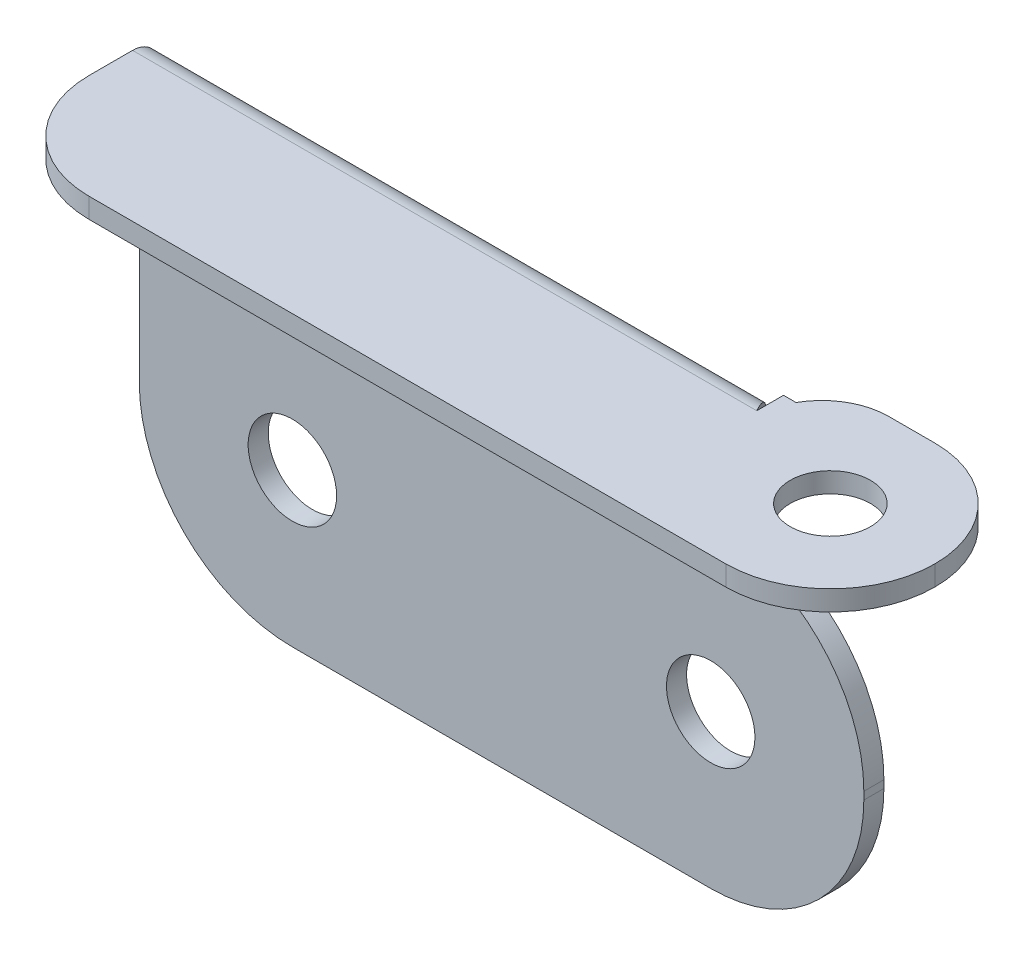
ISO-10303-21;
HEADER;
FILE_DESCRIPTION(('STEP AP214'),'2;1');
FILE_NAME('part.step','',(''),(''),'','','');
FILE_SCHEMA(('AUTOMOTIVE_DESIGN { 1 0 10303 214 1 1 1 1 }'));
ENDSEC;
DATA;
#1=APPLICATION_CONTEXT('core data for automotive mechanical design processes');
#2=APPLICATION_PROTOCOL_DEFINITION('international standard','automotive_design',2000,#1);
#3=PRODUCT_CONTEXT('',#1,'mechanical');
#4=PRODUCT('Part','Part','',(#3));
#5=PRODUCT_RELATED_PRODUCT_CATEGORY('part','',(#4));
#6=PRODUCT_DEFINITION_FORMATION('','',#4);
#7=PRODUCT_DEFINITION_CONTEXT('part definition',#1,'design');
#8=PRODUCT_DEFINITION('design','',#6,#7);
#9=PRODUCT_DEFINITION_SHAPE('','',#8);
#10=(LENGTH_UNIT() NAMED_UNIT(*) SI_UNIT(.MILLI.,.METRE.));
#11=(NAMED_UNIT(*) PLANE_ANGLE_UNIT() SI_UNIT($,.RADIAN.));
#12=(NAMED_UNIT(*) SI_UNIT($,.STERADIAN.) SOLID_ANGLE_UNIT());
#13=UNCERTAINTY_MEASURE_WITH_UNIT(LENGTH_MEASURE(1.E-05),#10,'distance_accuracy_value','');
#14=(GEOMETRIC_REPRESENTATION_CONTEXT(3) GLOBAL_UNCERTAINTY_ASSIGNED_CONTEXT((#13)) GLOBAL_UNIT_ASSIGNED_CONTEXT((#10,
#11,#12)) REPRESENTATION_CONTEXT('',''));
#15=CARTESIAN_POINT('',(0.,0.,0.));
#16=DIRECTION('',(0.,0.,1.));
#17=DIRECTION('',(1.,0.,0.));
#18=AXIS2_PLACEMENT_3D('',#15,#16,#17);
#19=CARTESIAN_POINT('',(19.8755,20.5105,13.9446));
#20=DIRECTION('',(1.,0.,0.));
#21=DIRECTION('',(0.,0.,-1.));
#22=AXIS2_PLACEMENT_3D('',#19,#20,#21);
#23=PLANE('',#22);
#24=CARTESIAN_POINT('',(19.8755,22.0345,2.032));
#25=CARTESIAN_POINT('',(19.8755,20.5105,2.032));
#26=B_SPLINE_CURVE_WITH_KNOTS('',1,(#24,#25),.UNSPECIFIED.,.F.,.F.,(2,2),(0.,1.),.UNSPECIFIED.);
#27=CARTESIAN_POINT('',(19.8755,22.0345,2.032));
#28=VERTEX_POINT('',#27);
#29=CARTESIAN_POINT('',(19.8755,20.5105,2.032));
#30=VERTEX_POINT('',#29);
#31=EDGE_CURVE('E11',#28,#30,#26,.T.);
#32=ORIENTED_EDGE('',*,*,#31,.F.);
#33=DIRECTION('',(0.,0.,1.));
#34=VECTOR('',#33,1.);
#35=CARTESIAN_POINT('',(19.8755,22.0345,13.2715));
#36=LINE('',#35,#34);
#37=CARTESIAN_POINT('',(19.8755,22.0345,0.));
#38=VERTEX_POINT('',#37);
#39=EDGE_CURVE('E126',#28,#38,#36,.F.);
#40=ORIENTED_EDGE('',*,*,#39,.T.);
#41=DIRECTION('',(0.,-1.,0.));
#42=VECTOR('',#41,1.);
#43=CARTESIAN_POINT('',(19.8755,20.5105,0.));
#44=LINE('',#43,#42);
#45=CARTESIAN_POINT('',(19.8755,20.5105,0.));
#46=VERTEX_POINT('',#45);
#47=EDGE_CURVE('E48',#38,#46,#44,.T.);
#48=ORIENTED_EDGE('',*,*,#47,.T.);
#49=DIRECTION('',(0.,0.,-1.));
#50=VECTOR('',#49,1.);
#51=CARTESIAN_POINT('',(19.8755,20.5105,13.9446));
#52=LINE('',#51,#50);
#53=EDGE_CURVE('E128',#30,#46,#52,.T.);
#54=ORIENTED_EDGE('',*,*,#53,.F.);
#55=EDGE_LOOP('',(#32,#40,#48,#54));
#56=FACE_BOUND('',#55,.T.);
#57=ADVANCED_FACE('F37',(#56),#23,.F.);
#58=CARTESIAN_POINT('',(19.8755,20.5105,0.));
#59=DIRECTION('',(0.,0.,1.));
#60=DIRECTION('',(1.,0.,0.));
#61=AXIS2_PLACEMENT_3D('',#58,#59,#60);
#62=PLANE('',#61);
#63=ORIENTED_EDGE('',*,*,#47,.F.);
#64=DIRECTION('',(-1.,0.,0.));
#65=VECTOR('',#64,1.);
#66=CARTESIAN_POINT('',(36.703,22.0345,0.));
#67=LINE('',#66,#65);
#68=CARTESIAN_POINT('',(20.828,22.0345,0.));
#69=VERTEX_POINT('',#68);
#70=EDGE_CURVE('E157',#38,#69,#67,.F.);
#71=ORIENTED_EDGE('',*,*,#70,.T.);
#72=DIRECTION('',(0.,-1.,0.));
#73=VECTOR('',#72,1.);
#74=CARTESIAN_POINT('',(20.828,20.5105,0.));
#75=LINE('',#74,#73);
#76=CARTESIAN_POINT('',(20.828,20.5105,0.));
#77=VERTEX_POINT('',#76);
#78=EDGE_CURVE('E205',#69,#77,#75,.T.);
#79=ORIENTED_EDGE('',*,*,#78,.T.);
#80=DIRECTION('',(1.,0.,0.));
#81=VECTOR('',#80,1.);
#82=CARTESIAN_POINT('',(19.8755,20.5105,0.));
#83=LINE('',#82,#81);
#84=EDGE_CURVE('E487',#46,#77,#83,.T.);
#85=ORIENTED_EDGE('',*,*,#84,.F.);
#86=EDGE_LOOP('',(#63,#71,#79,#85));
#87=FACE_BOUND('',#86,.T.);
#88=ADVANCED_FACE('F477',(#87),#62,.F.);
#89=CARTESIAN_POINT('',(25.2634647727155,20.5105,2.4765));
#90=DIRECTION('',(0.,1.,0.));
#91=DIRECTION('',(-1.,0.,0.));
#92=AXIS2_PLACEMENT_3D('',#89,#90,#91);
#93=CYLINDRICAL_SURFACE('',#92,5.08);
#94=ORIENTED_EDGE('',*,*,#78,.F.);
#95=CARTESIAN_POINT('',(25.2634647727155,22.0345,2.4765));
#96=DIRECTION('',(0.,1.,0.));
#97=DIRECTION('',(-1.,0.,0.));
#98=AXIS2_PLACEMENT_3D('',#95,#96,#97);
#99=CIRCLE('',#98,5.08);
#100=CARTESIAN_POINT('',(25.2634647727155,22.0345,-2.60349999999999));
#101=VERTEX_POINT('',#100);
#102=EDGE_CURVE('E367',#69,#101,#99,.F.);
#103=ORIENTED_EDGE('',*,*,#102,.T.);
#104=DIRECTION('',(0.,-1.,0.));
#105=VECTOR('',#104,1.);
#106=CARTESIAN_POINT('',(25.2634647727155,20.5105,-2.6035));
#107=LINE('',#106,#105);
#108=CARTESIAN_POINT('',(25.2634647727155,20.5105,-2.6035));
#109=VERTEX_POINT('',#108);
#110=EDGE_CURVE('E208',#101,#109,#107,.T.);
#111=ORIENTED_EDGE('',*,*,#110,.T.);
#112=CARTESIAN_POINT('',(25.2634647727155,20.5105,2.4765));
#113=DIRECTION('',(0.,1.,0.));
#114=DIRECTION('',(-1.,0.,0.));
#115=AXIS2_PLACEMENT_3D('',#112,#113,#114);
#116=CIRCLE('',#115,5.08);
#117=EDGE_CURVE('E548',#77,#109,#116,.F.);
#118=ORIENTED_EDGE('',*,*,#117,.F.);
#119=EDGE_LOOP('',(#94,#103,#111,#118));
#120=FACE_BOUND('',#119,.T.);
#121=ADVANCED_FACE('F474',(#120),#93,.T.);
#122=CARTESIAN_POINT('',(36.703,20.5105,-2.6035));
#123=DIRECTION('',(0.,0.,1.));
#124=DIRECTION('',(1.,0.,0.));
#125=AXIS2_PLACEMENT_3D('',#122,#123,#124);
#126=PLANE('',#125);
#127=ORIENTED_EDGE('',*,*,#110,.F.);
#128=DIRECTION('',(-1.,0.,0.));
#129=VECTOR('',#128,1.);
#130=CARTESIAN_POINT('',(36.703,22.0345,-2.60349999999999));
#131=LINE('',#130,#129);
#132=CARTESIAN_POINT('',(28.7655,22.0345,-2.6035));
#133=VERTEX_POINT('',#132);
#134=EDGE_CURVE('E364',#101,#133,#131,.F.);
#135=ORIENTED_EDGE('',*,*,#134,.T.);
#136=DIRECTION('',(0.,-1.,0.));
#137=VECTOR('',#136,1.);
#138=CARTESIAN_POINT('',(28.7655,20.5105,-2.6035));
#139=LINE('',#138,#137);
#140=CARTESIAN_POINT('',(28.7655,20.5105,-2.6035));
#141=VERTEX_POINT('',#140);
#142=EDGE_CURVE('E211',#133,#141,#139,.T.);
#143=ORIENTED_EDGE('',*,*,#142,.T.);
#144=DIRECTION('',(1.,0.,0.));
#145=VECTOR('',#144,1.);
#146=CARTESIAN_POINT('',(36.703,20.5105,-2.6035));
#147=LINE('',#146,#145);
#148=EDGE_CURVE('E545',#109,#141,#147,.T.);
#149=ORIENTED_EDGE('',*,*,#148,.F.);
#150=EDGE_LOOP('',(#127,#135,#143,#149));
#151=FACE_BOUND('',#150,.T.);
#152=ADVANCED_FACE('F470',(#151),#126,.F.);
#153=CARTESIAN_POINT('',(28.7655,20.5105,5.334));
#154=DIRECTION('',(0.,1.,0.));
#155=DIRECTION('',(-1.,0.,0.));
#156=AXIS2_PLACEMENT_3D('',#153,#154,#155);
#157=CYLINDRICAL_SURFACE('',#156,7.9375);
#158=ORIENTED_EDGE('',*,*,#142,.F.);
#159=CARTESIAN_POINT('',(28.7655,22.0345,5.334));
#160=DIRECTION('',(0.,1.,0.));
#161=DIRECTION('',(-1.,0.,0.));
#162=AXIS2_PLACEMENT_3D('',#159,#160,#161);
#163=CIRCLE('',#162,7.9375);
#164=CARTESIAN_POINT('',(36.703,22.0345,5.334));
#165=VERTEX_POINT('',#164);
#166=EDGE_CURVE('E361',#133,#165,#163,.F.);
#167=ORIENTED_EDGE('',*,*,#166,.T.);
#168=DIRECTION('',(0.,-1.,0.));
#169=VECTOR('',#168,1.);
#170=CARTESIAN_POINT('',(36.703,20.5105,5.334));
#171=LINE('',#170,#169);
#172=CARTESIAN_POINT('',(36.703,20.5105,5.334));
#173=VERTEX_POINT('',#172);
#174=EDGE_CURVE('E214',#165,#173,#171,.T.);
#175=ORIENTED_EDGE('',*,*,#174,.T.);
#176=CARTESIAN_POINT('',(28.7655,20.5105,5.334));
#177=DIRECTION('',(0.,1.,0.));
#178=DIRECTION('',(-1.,0.,0.));
#179=AXIS2_PLACEMENT_3D('',#176,#177,#178);
#180=CIRCLE('',#179,7.9375);
#181=EDGE_CURVE('E542',#141,#173,#180,.F.);
#182=ORIENTED_EDGE('',*,*,#181,.F.);
#183=EDGE_LOOP('',(#158,#167,#175,#182));
#184=FACE_BOUND('',#183,.T.);
#185=ADVANCED_FACE('F466',(#184),#157,.T.);
#186=CARTESIAN_POINT('',(28.7655,20.5105,5.334));
#187=DIRECTION('',(0.,1.,0.));
#188=DIRECTION('',(-1.,0.,0.));
#189=AXIS2_PLACEMENT_3D('',#186,#187,#188);
#190=CYLINDRICAL_SURFACE('',#189,7.9375);
#191=ORIENTED_EDGE('',*,*,#174,.F.);
#192=CARTESIAN_POINT('',(28.7655,22.0345,5.334));
#193=DIRECTION('',(0.,1.,0.));
#194=DIRECTION('',(-1.,0.,0.));
#195=AXIS2_PLACEMENT_3D('',#192,#193,#194);
#196=CIRCLE('',#195,7.9375);
#197=CARTESIAN_POINT('',(28.7655,22.0345,13.2715));
#198=VERTEX_POINT('',#197);
#199=EDGE_CURVE('E358',#165,#198,#196,.F.);
#200=ORIENTED_EDGE('',*,*,#199,.T.);
#201=DIRECTION('',(0.,-1.,0.));
#202=VECTOR('',#201,1.);
#203=CARTESIAN_POINT('',(28.7655,20.5105,13.2715));
#204=LINE('',#203,#202);
#205=CARTESIAN_POINT('',(28.7655,20.5105,13.2715));
#206=VERTEX_POINT('',#205);
#207=EDGE_CURVE('E217',#198,#206,#204,.T.);
#208=ORIENTED_EDGE('',*,*,#207,.T.);
#209=CARTESIAN_POINT('',(28.7655,20.5105,5.334));
#210=DIRECTION('',(0.,1.,0.));
#211=DIRECTION('',(-1.,0.,0.));
#212=AXIS2_PLACEMENT_3D('',#209,#210,#211);
#213=CIRCLE('',#212,7.9375);
#214=EDGE_CURVE('E538',#173,#206,#213,.F.);
#215=ORIENTED_EDGE('',*,*,#214,.F.);
#216=EDGE_LOOP('',(#191,#200,#208,#215));
#217=FACE_BOUND('',#216,.T.);
#218=ADVANCED_FACE('F462',(#217),#190,.T.);
#219=CARTESIAN_POINT('',(36.703,20.5105,13.2715));
#220=DIRECTION('',(0.,0.,1.));
#221=DIRECTION('',(1.,0.,0.));
#222=AXIS2_PLACEMENT_3D('',#219,#220,#221);
#223=PLANE('',#222);
#224=ORIENTED_EDGE('',*,*,#207,.F.);
#225=DIRECTION('',(-1.,0.,0.));
#226=VECTOR('',#225,1.);
#227=CARTESIAN_POINT('',(36.703,22.0345,13.2715));
#228=LINE('',#227,#226);
#229=CARTESIAN_POINT('',(-19.558,22.0345,13.2715));
#230=VERTEX_POINT('',#229);
#231=EDGE_CURVE('E355',#230,#198,#228,.F.);
#232=ORIENTED_EDGE('',*,*,#231,.F.);
#233=DIRECTION('',(0.,-1.,0.));
#234=VECTOR('',#233,1.);
#235=CARTESIAN_POINT('',(-19.558,20.5105,13.2715));
#236=LINE('',#235,#234);
#237=CARTESIAN_POINT('',(-19.558,20.5105,13.2715));
#238=VERTEX_POINT('',#237);
#239=EDGE_CURVE('E220',#230,#238,#236,.T.);
#240=ORIENTED_EDGE('',*,*,#239,.T.);
#241=DIRECTION('',(1.,0.,0.));
#242=VECTOR('',#241,1.);
#243=CARTESIAN_POINT('',(36.703,20.5105,13.2715));
#244=LINE('',#243,#242);
#245=EDGE_CURVE('E535',#238,#206,#244,.T.);
#246=ORIENTED_EDGE('',*,*,#245,.T.);
#247=EDGE_LOOP('',(#224,#232,#240,#246));
#248=FACE_BOUND('',#247,.T.);
#249=ADVANCED_FACE('F458',(#248),#223,.T.);
#250=CARTESIAN_POINT('',(-19.558,20.5105,5.334));
#251=DIRECTION('',(0.,1.,0.));
#252=DIRECTION('',(-1.,0.,0.));
#253=AXIS2_PLACEMENT_3D('',#250,#251,#252);
#254=CYLINDRICAL_SURFACE('',#253,7.9375);
#255=ORIENTED_EDGE('',*,*,#239,.F.);
#256=CARTESIAN_POINT('',(-19.558,22.0345,5.334));
#257=DIRECTION('',(0.,1.,0.));
#258=DIRECTION('',(-1.,0.,0.));
#259=AXIS2_PLACEMENT_3D('',#256,#257,#258);
#260=CIRCLE('',#259,7.9375);
#261=CARTESIAN_POINT('',(-27.4955,22.0345,5.33400000000002));
#262=VERTEX_POINT('',#261);
#263=EDGE_CURVE('E352',#230,#262,#260,.F.);
#264=ORIENTED_EDGE('',*,*,#263,.T.);
#265=DIRECTION('',(0.,-1.,0.));
#266=VECTOR('',#265,1.);
#267=CARTESIAN_POINT('',(-27.4955,20.5105,5.33400000000001));
#268=LINE('',#267,#266);
#269=CARTESIAN_POINT('',(-27.4955,20.5105,5.33400000000001));
#270=VERTEX_POINT('',#269);
#271=EDGE_CURVE('E223',#262,#270,#268,.T.);
#272=ORIENTED_EDGE('',*,*,#271,.T.);
#273=CARTESIAN_POINT('',(-19.558,20.5105,5.334));
#274=DIRECTION('',(0.,1.,0.));
#275=DIRECTION('',(-1.,0.,0.));
#276=AXIS2_PLACEMENT_3D('',#273,#274,#275);
#277=CIRCLE('',#276,7.9375);
#278=EDGE_CURVE('E499',#238,#270,#277,.F.);
#279=ORIENTED_EDGE('',*,*,#278,.F.);
#280=EDGE_LOOP('',(#255,#264,#272,#279));
#281=FACE_BOUND('',#280,.T.);
#282=ADVANCED_FACE('F454',(#281),#254,.T.);
#283=CARTESIAN_POINT('',(-27.4955,20.5105,58.4457141962647));
#284=DIRECTION('',(1.,0.,0.));
#285=DIRECTION('',(0.,0.,-1.));
#286=AXIS2_PLACEMENT_3D('',#283,#284,#285);
#287=PLANE('',#286);
#288=ORIENTED_EDGE('',*,*,#271,.F.);
#289=DIRECTION('',(0.,0.,1.));
#290=VECTOR('',#289,1.);
#291=CARTESIAN_POINT('',(-27.4955,22.0345,13.2715));
#292=LINE('',#291,#290);
#293=CARTESIAN_POINT('',(-27.4955,22.0345,2.03200000000002));
#294=VERTEX_POINT('',#293);
#295=EDGE_CURVE('E159',#262,#294,#292,.F.);
#296=ORIENTED_EDGE('',*,*,#295,.T.);
#297=DIRECTION('',(0.,-1.,0.));
#298=VECTOR('',#297,1.);
#299=CARTESIAN_POINT('',(-27.4955,20.5105,2.03200000000001));
#300=LINE('',#299,#298);
#301=CARTESIAN_POINT('',(-27.4955,20.5105,2.03200000000001));
#302=VERTEX_POINT('',#301);
#303=EDGE_CURVE('E226',#294,#302,#300,.T.);
#304=ORIENTED_EDGE('',*,*,#303,.T.);
#305=DIRECTION('',(0.,0.,-1.));
#306=VECTOR('',#305,1.);
#307=CARTESIAN_POINT('',(-27.4955,20.5105,58.4457141962647));
#308=LINE('',#307,#306);
#309=EDGE_CURVE('E496',#270,#302,#308,.T.);
#310=ORIENTED_EDGE('',*,*,#309,.F.);
#311=EDGE_LOOP('',(#288,#296,#304,#310));
#312=FACE_BOUND('',#311,.T.);
#313=ADVANCED_FACE('F451',(#312),#287,.F.);
#314=CARTESIAN_POINT('',(-27.4955,20.0025,2.032));
#315=DIRECTION('',(-1.,0.,0.));
#316=DIRECTION('',(0.,-1.,0.));
#317=AXIS2_PLACEMENT_3D('',#314,#315,#316);
#318=PLANE('',#317);
#319=ORIENTED_EDGE('',*,*,#303,.F.);
#320=CARTESIAN_POINT('',(-27.4955,20.0025,2.032));
#321=DIRECTION('',(1.,0.,0.));
#322=DIRECTION('',(0.,1.,0.));
#323=AXIS2_PLACEMENT_3D('',#320,#321,#322);
#324=CIRCLE('',#323,2.032);
#325=CARTESIAN_POINT('',(-27.4955,20.0025,0.));
#326=VERTEX_POINT('',#325);
#327=EDGE_CURVE('E146',#294,#326,#324,.F.);
#328=ORIENTED_EDGE('',*,*,#327,.T.);
#329=DIRECTION('',(0.,0.,1.));
#330=VECTOR('',#329,1.);
#331=CARTESIAN_POINT('',(-27.4955,20.0025,1.524));
#332=LINE('',#331,#330);
#333=CARTESIAN_POINT('',(-27.4955,20.0025,1.524));
#334=VERTEX_POINT('',#333);
#335=EDGE_CURVE('E229',#326,#334,#332,.T.);
#336=ORIENTED_EDGE('',*,*,#335,.T.);
#337=CARTESIAN_POINT('',(-27.4955,20.0025,2.032));
#338=DIRECTION('',(1.,0.,0.));
#339=DIRECTION('',(0.,1.,0.));
#340=AXIS2_PLACEMENT_3D('',#337,#338,#339);
#341=CIRCLE('',#340,0.508);
#342=EDGE_CURVE('E280',#302,#334,#341,.F.);
#343=ORIENTED_EDGE('',*,*,#342,.F.);
#344=EDGE_LOOP('',(#319,#328,#336,#343));
#345=FACE_BOUND('',#344,.T.);
#346=ADVANCED_FACE('F448',(#345),#318,.T.);
#347=CARTESIAN_POINT('',(-27.4955,22.0345,1.524));
#348=DIRECTION('',(-1.,0.,0.));
#349=DIRECTION('',(0.,-1.,0.));
#350=AXIS2_PLACEMENT_3D('',#347,#348,#349);
#351=PLANE('',#350);
#352=ORIENTED_EDGE('',*,*,#335,.F.);
#353=DIRECTION('',(0.,1.,0.));
#354=VECTOR('',#353,1.);
#355=CARTESIAN_POINT('',(-27.4955,0.,0.));
#356=LINE('',#355,#354);
#357=CARTESIAN_POINT('',(-27.4955,0.,0.));
#358=VERTEX_POINT('',#357);
#359=EDGE_CURVE('E326',#326,#358,#356,.F.);
#360=ORIENTED_EDGE('',*,*,#359,.T.);
#361=DIRECTION('',(0.,0.,1.));
#362=VECTOR('',#361,1.);
#363=CARTESIAN_POINT('',(-27.4955,0.,1.524));
#364=LINE('',#363,#362);
#365=CARTESIAN_POINT('',(-27.4955,0.,1.524));
#366=VERTEX_POINT('',#365);
#367=EDGE_CURVE('E231',#358,#366,#364,.T.);
#368=ORIENTED_EDGE('',*,*,#367,.T.);
#369=DIRECTION('',(0.,-1.,0.));
#370=VECTOR('',#369,1.);
#371=CARTESIAN_POINT('',(-27.4955,22.0345,1.524));
#372=LINE('',#371,#370);
#373=EDGE_CURVE('E291',#334,#366,#372,.T.);
#374=ORIENTED_EDGE('',*,*,#373,.F.);
#375=EDGE_LOOP('',(#352,#360,#368,#374));
#376=FACE_BOUND('',#375,.T.);
#377=ADVANCED_FACE('F292',(#376),#351,.T.);
#378=CARTESIAN_POINT('',(-15.875,0.,1.524));
#379=DIRECTION('',(0.,0.,1.));
#380=DIRECTION('',(1.,0.,0.));
#381=AXIS2_PLACEMENT_3D('',#378,#379,#380);
#382=CYLINDRICAL_SURFACE('',#381,11.6205);
#383=ORIENTED_EDGE('',*,*,#367,.F.);
#384=CARTESIAN_POINT('',(-15.875,0.,0.));
#385=DIRECTION('',(0.,0.,1.));
#386=DIRECTION('',(1.,0.,0.));
#387=AXIS2_PLACEMENT_3D('',#384,#385,#386);
#388=CIRCLE('',#387,11.6205);
#389=CARTESIAN_POINT('',(-15.875,-11.6205,0.));
#390=VERTEX_POINT('',#389);
#391=EDGE_CURVE('E345',#358,#390,#388,.T.);
#392=ORIENTED_EDGE('',*,*,#391,.T.);
#393=DIRECTION('',(0.,0.,1.));
#394=VECTOR('',#393,1.);
#395=CARTESIAN_POINT('',(-15.875,-11.6205,1.524));
#396=LINE('',#395,#394);
#397=CARTESIAN_POINT('',(-15.875,-11.6205,1.524));
#398=VERTEX_POINT('',#397);
#399=EDGE_CURVE('E234',#390,#398,#396,.T.);
#400=ORIENTED_EDGE('',*,*,#399,.T.);
#401=CARTESIAN_POINT('',(-15.875,0.,1.524));
#402=DIRECTION('',(0.,0.,1.));
#403=DIRECTION('',(1.,0.,0.));
#404=AXIS2_PLACEMENT_3D('',#401,#402,#403);
#405=CIRCLE('',#404,11.6205);
#406=EDGE_CURVE('E297',#366,#398,#405,.T.);
#407=ORIENTED_EDGE('',*,*,#406,.F.);
#408=EDGE_LOOP('',(#383,#392,#400,#407));
#409=FACE_BOUND('',#408,.T.);
#410=ADVANCED_FACE('F441',(#409),#382,.T.);
#411=CARTESIAN_POINT('',(-27.4955,-11.6205,1.524));
#412=DIRECTION('',(0.,-1.,0.));
#413=DIRECTION('',(1.,0.,0.));
#414=AXIS2_PLACEMENT_3D('',#411,#412,#413);
#415=PLANE('',#414);
#416=ORIENTED_EDGE('',*,*,#399,.F.);
#417=DIRECTION('',(1.,0.,0.));
#418=VECTOR('',#417,1.);
#419=CARTESIAN_POINT('',(0.,-11.6205,0.));
#420=LINE('',#419,#418);
#421=CARTESIAN_POINT('',(15.875,-11.6205,0.));
#422=VERTEX_POINT('',#421);
#423=EDGE_CURVE('E342',#390,#422,#420,.T.);
#424=ORIENTED_EDGE('',*,*,#423,.T.);
#425=DIRECTION('',(0.,0.,1.));
#426=VECTOR('',#425,1.);
#427=CARTESIAN_POINT('',(15.875,-11.6205,1.524));
#428=LINE('',#427,#426);
#429=CARTESIAN_POINT('',(15.875,-11.6205,1.524));
#430=VERTEX_POINT('',#429);
#431=EDGE_CURVE('E237',#422,#430,#428,.T.);
#432=ORIENTED_EDGE('',*,*,#431,.T.);
#433=DIRECTION('',(1.,0.,0.));
#434=VECTOR('',#433,1.);
#435=CARTESIAN_POINT('',(-27.4955,-11.6205,1.524));
#436=LINE('',#435,#434);
#437=EDGE_CURVE('E300',#398,#430,#436,.T.);
#438=ORIENTED_EDGE('',*,*,#437,.F.);
#439=EDGE_LOOP('',(#416,#424,#432,#438));
#440=FACE_BOUND('',#439,.T.);
#441=ADVANCED_FACE('F437',(#440),#415,.T.);
#442=CARTESIAN_POINT('',(15.875,0.,1.524));
#443=DIRECTION('',(0.,0.,1.));
#444=DIRECTION('',(1.,0.,0.));
#445=AXIS2_PLACEMENT_3D('',#442,#443,#444);
#446=CYLINDRICAL_SURFACE('',#445,11.6205);
#447=ORIENTED_EDGE('',*,*,#431,.F.);
#448=CARTESIAN_POINT('',(15.875,0.,0.));
#449=DIRECTION('',(0.,0.,1.));
#450=DIRECTION('',(1.,0.,0.));
#451=AXIS2_PLACEMENT_3D('',#448,#449,#450);
#452=CIRCLE('',#451,11.6205);
#453=CARTESIAN_POINT('',(27.4955,0.,0.));
#454=VERTEX_POINT('',#453);
#455=EDGE_CURVE('E339',#422,#454,#452,.T.);
#456=ORIENTED_EDGE('',*,*,#455,.T.);
#457=DIRECTION('',(0.,0.,1.));
#458=VECTOR('',#457,1.);
#459=CARTESIAN_POINT('',(27.4955,0.,1.524));
#460=LINE('',#459,#458);
#461=CARTESIAN_POINT('',(27.4955,0.,1.524));
#462=VERTEX_POINT('',#461);
#463=EDGE_CURVE('E240',#454,#462,#460,.T.);
#464=ORIENTED_EDGE('',*,*,#463,.T.);
#465=CARTESIAN_POINT('',(15.875,0.,1.524));
#466=DIRECTION('',(0.,0.,1.));
#467=DIRECTION('',(1.,0.,0.));
#468=AXIS2_PLACEMENT_3D('',#465,#466,#467);
#469=CIRCLE('',#468,11.6205);
#470=EDGE_CURVE('E309',#430,#462,#469,.T.);
#471=ORIENTED_EDGE('',*,*,#470,.F.);
#472=EDGE_LOOP('',(#447,#456,#464,#471));
#473=FACE_BOUND('',#472,.T.);
#474=ADVANCED_FACE('F433',(#473),#446,.T.);
#475=CARTESIAN_POINT('',(27.4955,11.6205,1.524));
#476=DIRECTION('',(1.,0.,0.));
#477=DIRECTION('',(0.,1.,0.));
#478=AXIS2_PLACEMENT_3D('',#475,#476,#477);
#479=PLANE('',#478);
#480=ORIENTED_EDGE('',*,*,#463,.F.);
#481=DIRECTION('',(0.,1.,0.));
#482=VECTOR('',#481,1.);
#483=CARTESIAN_POINT('',(27.4955,0.,0.));
#484=LINE('',#483,#482);
#485=CARTESIAN_POINT('',(27.4955,0.576842171565131,0.));
#486=VERTEX_POINT('',#485);
#487=EDGE_CURVE('E336',#454,#486,#484,.T.);
#488=ORIENTED_EDGE('',*,*,#487,.T.);
#489=DIRECTION('',(0.,0.,1.));
#490=VECTOR('',#489,1.);
#491=CARTESIAN_POINT('',(27.4955,0.576842171565131,1.524));
#492=LINE('',#491,#490);
#493=CARTESIAN_POINT('',(27.4955,0.576842171565131,1.524));
#494=VERTEX_POINT('',#493);
#495=EDGE_CURVE('E243',#486,#494,#492,.T.);
#496=ORIENTED_EDGE('',*,*,#495,.T.);
#497=DIRECTION('',(0.,1.,0.));
#498=VECTOR('',#497,1.);
#499=CARTESIAN_POINT('',(27.4955,11.6205,1.524));
#500=LINE('',#499,#498);
#501=EDGE_CURVE('E312',#462,#494,#500,.T.);
#502=ORIENTED_EDGE('',*,*,#501,.F.);
#503=EDGE_LOOP('',(#480,#488,#496,#502));
#504=FACE_BOUND('',#503,.T.);
#505=ADVANCED_FACE('F429',(#504),#479,.T.);
#506=CARTESIAN_POINT('',(15.875,0.576842171565131,1.524));
#507=DIRECTION('',(0.,0.,1.));
#508=DIRECTION('',(1.,0.,0.));
#509=AXIS2_PLACEMENT_3D('',#506,#507,#508);
#510=CYLINDRICAL_SURFACE('',#509,11.6205);
#511=ORIENTED_EDGE('',*,*,#495,.F.);
#512=CARTESIAN_POINT('',(15.875,0.576842171565131,0.));
#513=DIRECTION('',(0.,0.,1.));
#514=DIRECTION('',(1.,0.,0.));
#515=AXIS2_PLACEMENT_3D('',#512,#513,#514);
#516=CIRCLE('',#515,11.6205);
#517=CARTESIAN_POINT('',(19.1579215246637,11.7239694478144,0.));
#518=VERTEX_POINT('',#517);
#519=EDGE_CURVE('E333',#486,#518,#516,.T.);
#520=ORIENTED_EDGE('',*,*,#519,.T.);
#521=DIRECTION('',(0.,0.,1.));
#522=VECTOR('',#521,1.);
#523=CARTESIAN_POINT('',(19.1579215246637,11.7239694478144,1.524));
#524=LINE('',#523,#522);
#525=CARTESIAN_POINT('',(19.1579215246637,11.7239694478144,1.524));
#526=VERTEX_POINT('',#525);
#527=EDGE_CURVE('E246',#518,#526,#524,.T.);
#528=ORIENTED_EDGE('',*,*,#527,.T.);
#529=CARTESIAN_POINT('',(15.875,0.576842171565131,1.524));
#530=DIRECTION('',(0.,0.,1.));
#531=DIRECTION('',(1.,0.,0.));
#532=AXIS2_PLACEMENT_3D('',#529,#530,#531);
#533=CIRCLE('',#532,11.6205);
#534=EDGE_CURVE('E315',#494,#526,#533,.T.);
#535=ORIENTED_EDGE('',*,*,#534,.F.);
#536=EDGE_LOOP('',(#511,#520,#528,#535));
#537=FACE_BOUND('',#536,.T.);
#538=ADVANCED_FACE('F426',(#537),#510,.T.);
#539=CARTESIAN_POINT('',(19.8755,14.1605,1.524));
#540=DIRECTION('',(0.,0.,1.));
#541=DIRECTION('',(1.,0.,0.));
#542=AXIS2_PLACEMENT_3D('',#539,#540,#541);
#543=CYLINDRICAL_SURFACE('',#542,2.54);
#544=ORIENTED_EDGE('',*,*,#527,.F.);
#545=CARTESIAN_POINT('',(19.8755,14.1605,0.));
#546=DIRECTION('',(0.,0.,1.));
#547=DIRECTION('',(1.,0.,0.));
#548=AXIS2_PLACEMENT_3D('',#545,#546,#547);
#549=CIRCLE('',#548,2.54);
#550=CARTESIAN_POINT('',(17.3355,14.1605,0.));
#551=VERTEX_POINT('',#550);
#552=EDGE_CURVE('E330',#551,#518,#549,.T.);
#553=ORIENTED_EDGE('',*,*,#552,.F.);
#554=DIRECTION('',(0.,0.,1.));
#555=VECTOR('',#554,1.);
#556=CARTESIAN_POINT('',(17.3355,14.1605,1.524));
#557=LINE('',#556,#555);
#558=CARTESIAN_POINT('',(17.3355,14.1605,1.524));
#559=VERTEX_POINT('',#558);
#560=EDGE_CURVE('E248',#551,#559,#557,.T.);
#561=ORIENTED_EDGE('',*,*,#560,.T.);
#562=CARTESIAN_POINT('',(19.8755,14.1605,1.524));
#563=DIRECTION('',(0.,0.,1.));
#564=DIRECTION('',(1.,0.,0.));
#565=AXIS2_PLACEMENT_3D('',#562,#563,#564);
#566=CIRCLE('',#565,2.54);
#567=EDGE_CURVE('E318',#559,#526,#566,.T.);
#568=ORIENTED_EDGE('',*,*,#567,.T.);
#569=EDGE_LOOP('',(#544,#553,#561,#568));
#570=FACE_BOUND('',#569,.T.);
#571=ADVANCED_FACE('F423',(#570),#543,.F.);
#572=CARTESIAN_POINT('',(17.3355,0.,1.524));
#573=DIRECTION('',(-1.,0.,0.));
#574=DIRECTION('',(0.,-1.,0.));
#575=AXIS2_PLACEMENT_3D('',#572,#573,#574);
#576=PLANE('',#575);
#577=ORIENTED_EDGE('',*,*,#560,.F.);
#578=DIRECTION('',(0.,1.,0.));
#579=VECTOR('',#578,1.);
#580=CARTESIAN_POINT('',(17.3355,0.,0.));
#581=LINE('',#580,#579);
#582=CARTESIAN_POINT('',(17.3355,17.9705,0.));
#583=VERTEX_POINT('',#582);
#584=EDGE_CURVE('E327',#583,#551,#581,.F.);
#585=ORIENTED_EDGE('',*,*,#584,.F.);
#586=DIRECTION('',(0.,0.,1.));
#587=VECTOR('',#586,1.);
#588=CARTESIAN_POINT('',(17.3355,17.9705,1.524));
#589=LINE('',#588,#587);
#590=CARTESIAN_POINT('',(17.3355,17.9705,1.524));
#591=VERTEX_POINT('',#590);
#592=EDGE_CURVE('E172',#583,#591,#589,.T.);
#593=ORIENTED_EDGE('',*,*,#592,.T.);
#594=DIRECTION('',(0.,-1.,0.));
#595=VECTOR('',#594,1.);
#596=CARTESIAN_POINT('',(17.3355,0.,1.524));
#597=LINE('',#596,#595);
#598=EDGE_CURVE('E281',#591,#559,#597,.T.);
#599=ORIENTED_EDGE('',*,*,#598,.T.);
#600=EDGE_LOOP('',(#577,#585,#593,#599));
#601=FACE_BOUND('',#600,.T.);
#602=ADVANCED_FACE('F405',(#601),#576,.F.);
#603=CARTESIAN_POINT('',(19.8755,17.9705,1.524));
#604=DIRECTION('',(0.,0.,1.));
#605=DIRECTION('',(1.,0.,0.));
#606=AXIS2_PLACEMENT_3D('',#603,#604,#605);
#607=CYLINDRICAL_SURFACE('',#606,2.54);
#608=ORIENTED_EDGE('',*,*,#592,.F.);
#609=CARTESIAN_POINT('',(19.8755,17.9705,0.));
#610=DIRECTION('',(0.,0.,1.));
#611=DIRECTION('',(1.,0.,0.));
#612=AXIS2_PLACEMENT_3D('',#609,#610,#611);
#613=CIRCLE('',#612,2.54);
#614=CARTESIAN_POINT('',(18.3515,20.0025,0.));
#615=VERTEX_POINT('',#614);
#616=EDGE_CURVE('E151',#615,#583,#613,.T.);
#617=ORIENTED_EDGE('',*,*,#616,.F.);
#618=CARTESIAN_POINT('',(18.3515,20.0025,1.524));
#619=CARTESIAN_POINT('',(18.3515,20.0025,0.));
#620=B_SPLINE_CURVE_WITH_KNOTS('',1,(#618,#619),.UNSPECIFIED.,.F.,.F.,(2,2),(0.,1.),.UNSPECIFIED.);
#621=CARTESIAN_POINT('',(18.3515,20.0025,1.524));
#622=VERTEX_POINT('',#621);
#623=EDGE_CURVE('E56',#615,#622,#620,.F.);
#624=ORIENTED_EDGE('',*,*,#623,.T.);
#625=CARTESIAN_POINT('',(19.8755,17.9705,1.524));
#626=DIRECTION('',(0.,0.,1.));
#627=DIRECTION('',(1.,0.,0.));
#628=AXIS2_PLACEMENT_3D('',#625,#626,#627);
#629=CIRCLE('',#628,2.54);
#630=EDGE_CURVE('E269',#622,#591,#629,.T.);
#631=ORIENTED_EDGE('',*,*,#630,.T.);
#632=EDGE_LOOP('',(#608,#617,#624,#631));
#633=FACE_BOUND('',#632,.T.);
#634=ADVANCED_FACE('F401',(#633),#607,.F.);
#635=CARTESIAN_POINT('',(28.7655,20.5105,5.334));
#636=DIRECTION('',(0.,1.,0.));
#637=DIRECTION('',(-1.,0.,0.));
#638=AXIS2_PLACEMENT_3D('',#635,#636,#637);
#639=CYLINDRICAL_SURFACE('',#638,3.048);
#640=CARTESIAN_POINT('',(28.7655,20.5105,5.334));
#641=DIRECTION('',(0.,-1.,0.));
#642=DIRECTION('',(1.,0.,0.));
#643=AXIS2_PLACEMENT_3D('',#640,#641,#642);
#644=CIRCLE('',#643,3.048);
#645=CARTESIAN_POINT('',(25.7175,20.5105,5.334));
#646=VERTEX_POINT('',#645);
#647=EDGE_CURVE('E288',#646,#646,#644,.T.);
#648=CARTESIAN_POINT('',(28.7655,22.0345,5.334));
#649=DIRECTION('',(0.,-1.,0.));
#650=DIRECTION('',(1.,0.,0.));
#651=AXIS2_PLACEMENT_3D('',#648,#649,#650);
#652=CIRCLE('',#651,3.048);
#653=CARTESIAN_POINT('',(25.7175,22.0345,5.334));
#654=VERTEX_POINT('',#653);
#655=EDGE_CURVE('E350',#654,#654,#652,.T.);
#656=CARTESIAN_POINT('',(25.7175,20.5105,5.334));
#657=CARTESIAN_POINT('',(25.7175,20.526375,5.334));
#658=CARTESIAN_POINT('',(25.7175,20.54225,5.334));
#659=CARTESIAN_POINT('',(25.7175,20.574,5.334));
#660=CARTESIAN_POINT('',(25.7175,20.589875,5.334));
#661=CARTESIAN_POINT('',(25.7175,20.621625,5.334));
#662=CARTESIAN_POINT('',(25.7175,20.6375,5.334));
#663=CARTESIAN_POINT('',(25.7175,20.66925,5.334));
#664=CARTESIAN_POINT('',(25.7175,20.685125,5.334));
#665=CARTESIAN_POINT('',(25.7175,20.716875,5.334));
#666=CARTESIAN_POINT('',(25.7175,20.73275,5.334));
#667=CARTESIAN_POINT('',(25.7175,20.7645,5.334));
#668=CARTESIAN_POINT('',(25.7175,20.780375,5.334));
#669=CARTESIAN_POINT('',(25.7175,20.812125,5.334));
#670=CARTESIAN_POINT('',(25.7175,20.828,5.334));
#671=CARTESIAN_POINT('',(25.7175,20.85975,5.334));
#672=CARTESIAN_POINT('',(25.7175,20.875625,5.334));
#673=CARTESIAN_POINT('',(25.7175,20.907375,5.334));
#674=CARTESIAN_POINT('',(25.7175,20.92325,5.334));
#675=CARTESIAN_POINT('',(25.7175,20.955,5.334));
#676=CARTESIAN_POINT('',(25.7175,20.970875,5.334));
#677=CARTESIAN_POINT('',(25.7175,21.002625,5.334));
#678=CARTESIAN_POINT('',(25.7175,21.0185,5.334));
#679=CARTESIAN_POINT('',(25.7175,21.05025,5.334));
#680=CARTESIAN_POINT('',(25.7175,21.066125,5.334));
#681=CARTESIAN_POINT('',(25.7175,21.097875,5.334));
#682=CARTESIAN_POINT('',(25.7175,21.11375,5.334));
#683=CARTESIAN_POINT('',(25.7175,21.1455,5.334));
#684=CARTESIAN_POINT('',(25.7175,21.161375,5.334));
#685=CARTESIAN_POINT('',(25.7175,21.193125,5.334));
#686=CARTESIAN_POINT('',(25.7175,21.209,5.334));
#687=CARTESIAN_POINT('',(25.7175,21.24075,5.334));
#688=CARTESIAN_POINT('',(25.7175,21.256625,5.334));
#689=CARTESIAN_POINT('',(25.7175,21.288375,5.334));
#690=CARTESIAN_POINT('',(25.7175,21.30425,5.334));
#691=CARTESIAN_POINT('',(25.7175,21.336,5.334));
#692=CARTESIAN_POINT('',(25.7175,21.351875,5.334));
#693=CARTESIAN_POINT('',(25.7175,21.383625,5.334));
#694=CARTESIAN_POINT('',(25.7175,21.3995,5.334));
#695=CARTESIAN_POINT('',(25.7175,21.43125,5.334));
#696=CARTESIAN_POINT('',(25.7175,21.447125,5.334));
#697=CARTESIAN_POINT('',(25.7175,21.478875,5.334));
#698=CARTESIAN_POINT('',(25.7175,21.49475,5.334));
#699=CARTESIAN_POINT('',(25.7175,21.5265,5.334));
#700=CARTESIAN_POINT('',(25.7175,21.542375,5.334));
#701=CARTESIAN_POINT('',(25.7175,21.574125,5.334));
#702=CARTESIAN_POINT('',(25.7175,21.59,5.334));
#703=CARTESIAN_POINT('',(25.7175,21.62175,5.334));
#704=CARTESIAN_POINT('',(25.7175,21.637625,5.334));
#705=CARTESIAN_POINT('',(25.7175,21.669375,5.334));
#706=CARTESIAN_POINT('',(25.7175,21.68525,5.334));
#707=CARTESIAN_POINT('',(25.7175,21.717,5.334));
#708=CARTESIAN_POINT('',(25.7175,21.732875,5.334));
#709=CARTESIAN_POINT('',(25.7175,21.764625,5.334));
#710=CARTESIAN_POINT('',(25.7175,21.7805,5.334));
#711=CARTESIAN_POINT('',(25.7175,21.81225,5.334));
#712=CARTESIAN_POINT('',(25.7175,21.828125,5.334));
#713=CARTESIAN_POINT('',(25.7175,21.859875,5.334));
#714=CARTESIAN_POINT('',(25.7175,21.87575,5.334));
#715=CARTESIAN_POINT('',(25.7175,21.9075,5.334));
#716=CARTESIAN_POINT('',(25.7175,21.923375,5.334));
#717=CARTESIAN_POINT('',(25.7175,21.955125,5.334));
#718=CARTESIAN_POINT('',(25.7175,21.971,5.334));
#719=CARTESIAN_POINT('',(25.7175,22.00275,5.334));
#720=CARTESIAN_POINT('',(25.7175,22.018625,5.334));
#721=CARTESIAN_POINT('',(25.7175,22.0345,5.334));
#722=B_SPLINE_CURVE_WITH_KNOTS('',3,(#656,#657,#658,#659,#660,#661,#662,#663,#664,#665,#666,
#667,#668,#669,#670,#671,#672,#673,#674,#675,#676,#677,#678,#679,#680,#681,#682,#683,#684,#685,
#686,#687,#688,#689,#690,#691,#692,#693,#694,#695,#696,#697,#698,#699,#700,#701,#702,#703,#704,
#705,#706,#707,#708,#709,#710,#711,#712,#713,#714,#715,#716,#717,#718,#719,#720,#721),
.UNSPECIFIED.,.F.,.F.,(4,2,2,2,2,2,2,2,2,2,2,2,2,2,2,2,2,2,2,2,2,2,2,2,2,2,2,2,2,2,2,2,4),(0.,
0.0476250000000025,0.0952500000000016,0.142875000000001,0.190500000000003,0.238125000000002,
0.285750000000001,0.333375,0.381000000000003,0.428625000000002,0.476250000000001,
0.523875000000004,0.571500000000003,0.619125000000002,0.666750000000001,0.714375000000003,
0.762000000000002,0.809625000000001,0.857250000000004,0.904875000000003,0.952500000000002,
1.000125,1.04775,1.095375,1.143,1.190625,1.23825,1.285875,1.3335,1.381125,1.42875,1.476375,
1.524),.UNSPECIFIED.);
#723=EDGE_CURVE('BSEAM39',#646,#654,#722,.T.);
#724=ORIENTED_EDGE('',*,*,#647,.T.);
#725=ORIENTED_EDGE('',*,*,#655,.F.);
#726=ORIENTED_EDGE('',*,*,#723,.T.);
#727=ORIENTED_EDGE('',*,*,#723,.F.);
#728=EDGE_LOOP('',(#724,#726,#725,#727));
#729=FACE_BOUND('',#728,.T.);
#730=ADVANCED_FACE('F39',(#729),#639,.F.);
#731=CARTESIAN_POINT('',(15.875,0.,1.524));
#732=DIRECTION('',(0.,0.,1.));
#733=DIRECTION('',(1.,0.,0.));
#734=AXIS2_PLACEMENT_3D('',#731,#732,#733);
#735=CYLINDRICAL_SURFACE('',#734,3.35614819821684);
#736=CARTESIAN_POINT('',(15.875,0.,1.524));
#737=DIRECTION('',(0.,0.,1.));
#738=DIRECTION('',(1.,0.,0.));
#739=AXIS2_PLACEMENT_3D('',#736,#737,#738);
#740=CIRCLE('',#739,3.35614819821684);
#741=CARTESIAN_POINT('',(19.2311481982168,0.,1.524));
#742=VERTEX_POINT('',#741);
#743=EDGE_CURVE('E303',#742,#742,#740,.T.);
#744=ORIENTED_EDGE('',*,*,#743,.T.);
#745=EDGE_LOOP('',(#744));
#746=FACE_BOUND('',#745,.T.);
#747=CARTESIAN_POINT('',(15.875,0.,0.));
#748=DIRECTION('',(0.,0.,1.));
#749=DIRECTION('',(1.,0.,0.));
#750=AXIS2_PLACEMENT_3D('',#747,#748,#749);
#751=CIRCLE('',#750,3.35614819821684);
#752=CARTESIAN_POINT('',(19.2311481982168,0.,0.));
#753=VERTEX_POINT('',#752);
#754=EDGE_CURVE('E158',#753,#753,#751,.T.);
#755=ORIENTED_EDGE('',*,*,#754,.F.);
#756=EDGE_LOOP('',(#755));
#757=FACE_BOUND('',#756,.T.);
#758=ADVANCED_FACE('F394',(#746,#757),#735,.F.);
#759=CARTESIAN_POINT('',(-15.875,0.,1.524));
#760=DIRECTION('',(0.,0.,1.));
#761=DIRECTION('',(1.,0.,0.));
#762=AXIS2_PLACEMENT_3D('',#759,#760,#761);
#763=CYLINDRICAL_SURFACE('',#762,3.35614819821683);
#764=CARTESIAN_POINT('',(-15.875,0.,1.524));
#765=DIRECTION('',(0.,0.,1.));
#766=DIRECTION('',(1.,0.,0.));
#767=AXIS2_PLACEMENT_3D('',#764,#765,#766);
#768=CIRCLE('',#767,3.35614819821683);
#769=CARTESIAN_POINT('',(-12.5188518017832,0.,1.524));
#770=VERTEX_POINT('',#769);
#771=EDGE_CURVE('E298',#770,#770,#768,.T.);
#772=ORIENTED_EDGE('',*,*,#771,.T.);
#773=EDGE_LOOP('',(#772));
#774=FACE_BOUND('',#773,.T.);
#775=CARTESIAN_POINT('',(-15.875,0.,0.));
#776=DIRECTION('',(0.,0.,1.));
#777=DIRECTION('',(1.,0.,0.));
#778=AXIS2_PLACEMENT_3D('',#775,#776,#777);
#779=CIRCLE('',#778,3.35614819821683);
#780=CARTESIAN_POINT('',(-12.5188518017832,0.,0.));
#781=VERTEX_POINT('',#780);
#782=EDGE_CURVE('E323',#781,#781,#779,.T.);
#783=ORIENTED_EDGE('',*,*,#782,.F.);
#784=EDGE_LOOP('',(#783));
#785=FACE_BOUND('',#784,.T.);
#786=ADVANCED_FACE('F185',(#774,#785),#763,.F.);
#787=CARTESIAN_POINT('',(18.3515,20.0025,0.));
#788=CARTESIAN_POINT('',(18.4096009916684,20.1768029750051,0.));
#789=CARTESIAN_POINT('',(18.4687494131747,20.3387333536301,0.02200957212971));
#790=CARTESIAN_POINT('',(18.589263509508,20.6401108018588,0.0963949644680735));
#791=CARTESIAN_POINT('',(18.6506345626909,20.7795577933865,0.148944625984794));
#792=CARTESIAN_POINT('',(18.7757338634489,21.0370875632438,0.27719376287534));
#793=CARTESIAN_POINT('',(18.8391510665701,21.1543990200384,0.352703884260761));
#794=CARTESIAN_POINT('',(18.9658314506615,21.3645411851982,0.518147098781996));
#795=CARTESIAN_POINT('',(19.0294097392892,21.4580243307889,0.608441476864181));
#796=CARTESIAN_POINT('',(19.349048734462,21.871849514466,1.08791762343441));
#797=CARTESIAN_POINT('',(19.6131461490205,22.0345,1.56269014047469));
#798=CARTESIAN_POINT('',(19.8755,22.0345,2.032));
#799=CARTESIAN_POINT('',(18.3515,20.0025,1.524));
#800=CARTESIAN_POINT('',(18.4096051018125,20.0460788263594,1.524));
#801=CARTESIAN_POINT('',(18.4687494131747,20.0865583384075,1.52950239303243));
#802=CARTESIAN_POINT('',(18.589263509508,20.1619027004647,1.54809874111702));
#803=CARTESIAN_POINT('',(18.6506345626909,20.1967644483467,1.56123615649598));
#804=CARTESIAN_POINT('',(18.7757338634489,20.2611468908111,1.59329844071863));
#805=CARTESIAN_POINT('',(18.8391510665701,20.2904747550096,1.61217597106519));
#806=CARTESIAN_POINT('',(18.9658314506615,20.3430102962995,1.6535367746955));
#807=CARTESIAN_POINT('',(19.0294097392892,20.3663810826972,1.67611036921605));
#808=CARTESIAN_POINT('',(19.349048734462,20.4698373786165,1.7959794058586));
#809=CARTESIAN_POINT('',(19.6127809529271,20.5105,1.91450921549648));
#810=CARTESIAN_POINT('',(19.8755,20.5105,2.032));
#811=B_SPLINE_SURFACE_WITH_KNOTS('',1,3,((#787,#788,#789,#790,#791,#792,#793,#794,#795,#796,
#797,#798),(#799,#800,#801,#802,#803,#804,#805,#806,#807,#808,#809,#810)),.UNSPECIFIED.,.F.,.F.,
.F.,(2,2),(4,2,2,2,2,4),(0.,1.),(0.,0.000214999846256222,0.000429999692512444,
0.000644999538768666,0.000859999385024888,0.00171999877004978),.UNSPECIFIED.);
#812=CARTESIAN_POINT('',(18.3515,20.0025,0.));
#813=CARTESIAN_POINT('',(18.4096009916684,20.1768029750051,0.));
#814=CARTESIAN_POINT('',(18.4687494131747,20.3387333536301,0.02200957212971));
#815=CARTESIAN_POINT('',(18.589263509508,20.6401108018588,0.0963949644680735));
#816=CARTESIAN_POINT('',(18.6506345626909,20.7795577933865,0.148944625984794));
#817=CARTESIAN_POINT('',(18.7757338634489,21.0370875632438,0.27719376287534));
#818=CARTESIAN_POINT('',(18.8391510665701,21.1543990200384,0.352703884260761));
#819=CARTESIAN_POINT('',(18.9658314506615,21.3645411851982,0.518147098781996));
#820=CARTESIAN_POINT('',(19.0294097392892,21.4580243307889,0.608441476864181));
#821=CARTESIAN_POINT('',(19.349048734462,21.871849514466,1.08791762343441));
#822=CARTESIAN_POINT('',(19.6131461490205,22.0345,1.56269014047469));
#823=CARTESIAN_POINT('',(19.8755,22.0345,2.032));
#824=B_SPLINE_CURVE_WITH_KNOTS('',3,(#812,#813,#814,#815,#816,#817,#818,#819,#820,#821,#822,
#823),.UNSPECIFIED.,.F.,.F.,(4,2,2,2,2,4),(0.,0.000214999846256222,0.000429999692512444,
0.000644999538768666,0.000859999385024888,0.00171999877004978),.UNSPECIFIED.);
#825=EDGE_CURVE('E143',#615,#28,#824,.T.);
#826=CARTESIAN_POINT('',(19.8755,20.5105,2.032));
#827=CARTESIAN_POINT('',(19.6127809529271,20.5105,1.91450921549648));
#828=CARTESIAN_POINT('',(19.349048734462,20.4698373786165,1.7959794058586));
#829=CARTESIAN_POINT('',(19.0294097392892,20.3663810826972,1.67611036921605));
#830=CARTESIAN_POINT('',(18.9658314506615,20.3430102962995,1.6535367746955));
#831=CARTESIAN_POINT('',(18.8391510665701,20.2904747550096,1.61217597106519));
#832=CARTESIAN_POINT('',(18.7757338634489,20.2611468908111,1.59329844071863));
#833=CARTESIAN_POINT('',(18.6506345626909,20.1967644483467,1.56123615649598));
#834=CARTESIAN_POINT('',(18.589263509508,20.1619027004647,1.54809874111702));
#835=CARTESIAN_POINT('',(18.4687494131747,20.0865583384075,1.52950239303243));
#836=CARTESIAN_POINT('',(18.4096051018125,20.0460788263594,1.524));
#837=CARTESIAN_POINT('',(18.3515,20.0025,1.524));
#838=B_SPLINE_CURVE_WITH_KNOTS('',3,(#826,#827,#828,#829,#830,#831,#832,#833,#834,#835,#836,
#837),.UNSPECIFIED.,.F.,.F.,(4,2,2,2,2,4),(0.,0.000859999385024888,0.00107499923128111,
0.00128999907753733,0.00150499892379355,0.00171999877004978),.UNSPECIFIED.);
#839=EDGE_CURVE('E276',#622,#30,#838,.F.);
#840=ORIENTED_EDGE('',*,*,#825,.T.);
#841=ORIENTED_EDGE('',*,*,#31,.T.);
#842=ORIENTED_EDGE('',*,*,#839,.F.);
#843=ORIENTED_EDGE('',*,*,#623,.F.);
#844=EDGE_LOOP('',(#840,#841,#842,#843));
#845=FACE_BOUND('',#844,.T.);
#846=ADVANCED_FACE('F162',(#845),#811,.F.);
#847=CARTESIAN_POINT('',(0.,0.,1.524));
#848=DIRECTION('',(0.,0.,1.));
#849=DIRECTION('',(1.,0.,0.));
#850=AXIS2_PLACEMENT_3D('',#847,#848,#849);
#851=PLANE('',#850);
#852=ORIENTED_EDGE('',*,*,#743,.F.);
#853=EDGE_LOOP('',(#852));
#854=FACE_BOUND('',#853,.T.);
#855=ORIENTED_EDGE('',*,*,#771,.F.);
#856=EDGE_LOOP('',(#855));
#857=FACE_BOUND('',#856,.T.);
#858=ORIENTED_EDGE('',*,*,#630,.F.);
#859=DIRECTION('',(1.,0.,0.));
#860=VECTOR('',#859,1.);
#861=CARTESIAN_POINT('',(0.,20.0025,1.524));
#862=LINE('',#861,#860);
#863=EDGE_CURVE('E261',#622,#334,#862,.F.);
#864=ORIENTED_EDGE('',*,*,#863,.T.);
#865=ORIENTED_EDGE('',*,*,#373,.T.);
#866=ORIENTED_EDGE('',*,*,#406,.T.);
#867=ORIENTED_EDGE('',*,*,#437,.T.);
#868=ORIENTED_EDGE('',*,*,#470,.T.);
#869=ORIENTED_EDGE('',*,*,#501,.T.);
#870=ORIENTED_EDGE('',*,*,#534,.T.);
#871=ORIENTED_EDGE('',*,*,#567,.F.);
#872=ORIENTED_EDGE('',*,*,#598,.F.);
#873=EDGE_LOOP('',(#858,#864,#865,#866,#867,#868,#869,#870,#871,#872));
#874=FACE_BOUND('',#873,.T.);
#875=ADVANCED_FACE('F184',(#854,#857,#874),#851,.T.);
#876=CARTESIAN_POINT('',(36.703,20.5105,13.2715));
#877=DIRECTION('',(0.,1.,0.));
#878=DIRECTION('',(-1.,0.,0.));
#879=AXIS2_PLACEMENT_3D('',#876,#877,#878);
#880=PLANE('',#879);
#881=ORIENTED_EDGE('',*,*,#647,.F.);
#882=EDGE_LOOP('',(#881));
#883=FACE_BOUND('',#882,.T.);
#884=ORIENTED_EDGE('',*,*,#309,.T.);
#885=DIRECTION('',(1.,0.,0.));
#886=VECTOR('',#885,1.);
#887=CARTESIAN_POINT('',(36.703,20.5105,2.032));
#888=LINE('',#887,#886);
#889=EDGE_CURVE('E263',#302,#30,#888,.T.);
#890=ORIENTED_EDGE('',*,*,#889,.T.);
#891=ORIENTED_EDGE('',*,*,#53,.T.);
#892=ORIENTED_EDGE('',*,*,#84,.T.);
#893=ORIENTED_EDGE('',*,*,#117,.T.);
#894=ORIENTED_EDGE('',*,*,#148,.T.);
#895=ORIENTED_EDGE('',*,*,#181,.T.);
#896=ORIENTED_EDGE('',*,*,#214,.T.);
#897=ORIENTED_EDGE('',*,*,#245,.F.);
#898=ORIENTED_EDGE('',*,*,#278,.T.);
#899=EDGE_LOOP('',(#884,#890,#891,#892,#893,#894,#895,#896,#897,#898));
#900=FACE_BOUND('',#899,.T.);
#901=ADVANCED_FACE('F492',(#883,#900),#880,.F.);
#902=CARTESIAN_POINT('',(36.703,20.0025,2.032));
#903=DIRECTION('',(1.,0.,0.));
#904=DIRECTION('',(0.,1.,0.));
#905=AXIS2_PLACEMENT_3D('',#902,#903,#904);
#906=CYLINDRICAL_SURFACE('',#905,0.508);
#907=ORIENTED_EDGE('',*,*,#342,.T.);
#908=ORIENTED_EDGE('',*,*,#863,.F.);
#909=ORIENTED_EDGE('',*,*,#839,.T.);
#910=ORIENTED_EDGE('',*,*,#889,.F.);
#911=EDGE_LOOP('',(#907,#908,#909,#910));
#912=FACE_BOUND('',#911,.T.);
#913=ADVANCED_FACE('F283',(#912),#906,.F.);
#914=CARTESIAN_POINT('',(0.,0.,0.));
#915=DIRECTION('',(0.,0.,1.));
#916=DIRECTION('',(1.,0.,0.));
#917=AXIS2_PLACEMENT_3D('',#914,#915,#916);
#918=PLANE('',#917);
#919=ORIENTED_EDGE('',*,*,#754,.T.);
#920=EDGE_LOOP('',(#919));
#921=FACE_BOUND('',#920,.T.);
#922=ORIENTED_EDGE('',*,*,#782,.T.);
#923=EDGE_LOOP('',(#922));
#924=FACE_BOUND('',#923,.T.);
#925=ORIENTED_EDGE('',*,*,#616,.T.);
#926=ORIENTED_EDGE('',*,*,#584,.T.);
#927=ORIENTED_EDGE('',*,*,#552,.T.);
#928=ORIENTED_EDGE('',*,*,#519,.F.);
#929=ORIENTED_EDGE('',*,*,#487,.F.);
#930=ORIENTED_EDGE('',*,*,#455,.F.);
#931=ORIENTED_EDGE('',*,*,#423,.F.);
#932=ORIENTED_EDGE('',*,*,#391,.F.);
#933=ORIENTED_EDGE('',*,*,#359,.F.);
#934=DIRECTION('',(1.,0.,0.));
#935=VECTOR('',#934,1.);
#936=CARTESIAN_POINT('',(0.,20.0025,0.));
#937=LINE('',#936,#935);
#938=EDGE_CURVE('E150',#615,#326,#937,.F.);
#939=ORIENTED_EDGE('',*,*,#938,.F.);
#940=EDGE_LOOP('',(#925,#926,#927,#928,#929,#930,#931,#932,#933,#939));
#941=FACE_BOUND('',#940,.T.);
#942=ADVANCED_FACE('F387',(#921,#924,#941),#918,.F.);
#943=CARTESIAN_POINT('',(36.703,22.0345,13.2715));
#944=DIRECTION('',(0.,1.,0.));
#945=DIRECTION('',(-1.,0.,0.));
#946=AXIS2_PLACEMENT_3D('',#943,#944,#945);
#947=PLANE('',#946);
#948=ORIENTED_EDGE('',*,*,#655,.T.);
#949=EDGE_LOOP('',(#948));
#950=FACE_BOUND('',#949,.T.);
#951=ORIENTED_EDGE('',*,*,#295,.F.);
#952=ORIENTED_EDGE('',*,*,#263,.F.);
#953=ORIENTED_EDGE('',*,*,#231,.T.);
#954=ORIENTED_EDGE('',*,*,#199,.F.);
#955=ORIENTED_EDGE('',*,*,#166,.F.);
#956=ORIENTED_EDGE('',*,*,#134,.F.);
#957=ORIENTED_EDGE('',*,*,#102,.F.);
#958=ORIENTED_EDGE('',*,*,#70,.F.);
#959=ORIENTED_EDGE('',*,*,#39,.F.);
#960=DIRECTION('',(-1.,0.,0.));
#961=VECTOR('',#960,1.);
#962=CARTESIAN_POINT('',(36.703,22.0345,2.03200000000002));
#963=LINE('',#962,#961);
#964=EDGE_CURVE('E140',#294,#28,#963,.F.);
#965=ORIENTED_EDGE('',*,*,#964,.F.);
#966=EDGE_LOOP('',(#951,#952,#953,#954,#955,#956,#957,#958,#959,#965));
#967=FACE_BOUND('',#966,.T.);
#968=ADVANCED_FACE('F154',(#950,#967),#947,.T.);
#969=CARTESIAN_POINT('',(36.703,20.0025,2.032));
#970=DIRECTION('',(1.,0.,0.));
#971=DIRECTION('',(0.,1.,0.));
#972=AXIS2_PLACEMENT_3D('',#969,#970,#971);
#973=CYLINDRICAL_SURFACE('',#972,2.032);
#974=ORIENTED_EDGE('',*,*,#327,.F.);
#975=ORIENTED_EDGE('',*,*,#964,.T.);
#976=ORIENTED_EDGE('',*,*,#825,.F.);
#977=ORIENTED_EDGE('',*,*,#938,.T.);
#978=EDGE_LOOP('',(#974,#975,#976,#977));
#979=FACE_BOUND('',#978,.T.);
#980=ADVANCED_FACE('F141',(#979),#973,.T.);
#981=CLOSED_SHELL('',(#57,#88,#121,#152,#185,#218,#249,#282,#313,#346,#377,#410,#441,#474,#505,
#538,#571,#602,#634,#730,#758,#786,#846,#875,#901,#913,#942,#968,#980));
#982=MANIFOLD_SOLID_BREP('B2',#981);
#983=ADVANCED_BREP_SHAPE_REPRESENTATION('',(#18,#982),#14);
#984=SHAPE_DEFINITION_REPRESENTATION(#9,#983);
ENDSEC;
END-ISO-10303-21;
